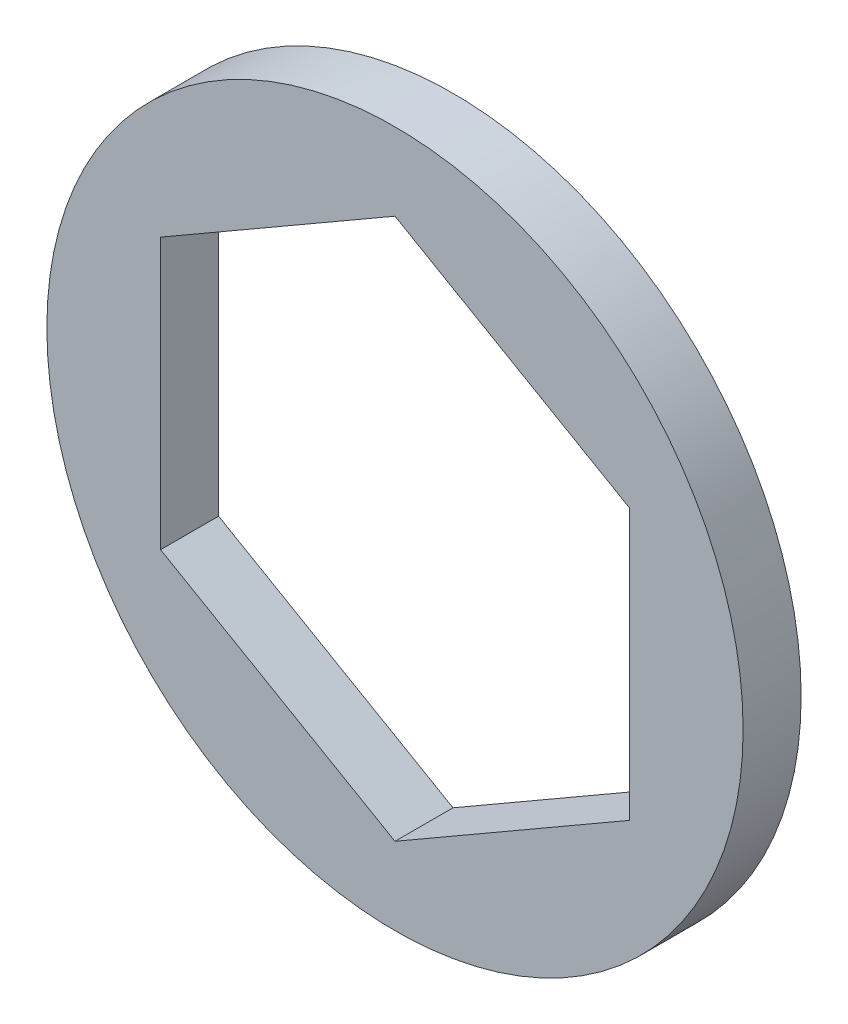
ISO-10303-21;
HEADER;
FILE_DESCRIPTION(('STEP AP214'),'2;1');
FILE_NAME('part.step','',(''),(''),'','','');
FILE_SCHEMA(('AUTOMOTIVE_DESIGN { 1 0 10303 214 1 1 1 1 }'));
ENDSEC;
DATA;
#1=APPLICATION_CONTEXT('core data for automotive mechanical design processes');
#2=APPLICATION_PROTOCOL_DEFINITION('international standard','automotive_design',2000,#1);
#3=PRODUCT_CONTEXT('',#1,'mechanical');
#4=PRODUCT('Part','Part','',(#3));
#5=PRODUCT_RELATED_PRODUCT_CATEGORY('part','',(#4));
#6=PRODUCT_DEFINITION_FORMATION('','',#4);
#7=PRODUCT_DEFINITION_CONTEXT('part definition',#1,'design');
#8=PRODUCT_DEFINITION('design','',#6,#7);
#9=PRODUCT_DEFINITION_SHAPE('','',#8);
#10=(LENGTH_UNIT() NAMED_UNIT(*) SI_UNIT(.MILLI.,.METRE.));
#11=(NAMED_UNIT(*) PLANE_ANGLE_UNIT() SI_UNIT($,.RADIAN.));
#12=(NAMED_UNIT(*) SI_UNIT($,.STERADIAN.) SOLID_ANGLE_UNIT());
#13=UNCERTAINTY_MEASURE_WITH_UNIT(LENGTH_MEASURE(1.E-05),#10,'distance_accuracy_value','');
#14=(GEOMETRIC_REPRESENTATION_CONTEXT(3) GLOBAL_UNCERTAINTY_ASSIGNED_CONTEXT((#13)) GLOBAL_UNIT_ASSIGNED_CONTEXT((#10,
#11,#12)) REPRESENTATION_CONTEXT('',''));
#15=CARTESIAN_POINT('',(0.,0.,0.));
#16=DIRECTION('',(0.,0.,1.));
#17=DIRECTION('',(1.,0.,0.));
#18=AXIS2_PLACEMENT_3D('',#15,#16,#17);
#19=CARTESIAN_POINT('',(0.,0.,1.5875));
#20=DIRECTION('',(0.,0.,1.));
#21=DIRECTION('',(1.,0.,0.));
#22=AXIS2_PLACEMENT_3D('',#19,#20,#21);
#23=PLANE('',#22);
#24=CARTESIAN_POINT('',(0.,0.,1.5875));
#25=DIRECTION('',(0.,0.,1.));
#26=DIRECTION('',(1.,0.,0.));
#27=AXIS2_PLACEMENT_3D('',#24,#25,#26);
#28=CIRCLE('',#27,9.525);
#29=CARTESIAN_POINT('',(9.525,0.,1.5875));
#30=VERTEX_POINT('',#29);
#31=EDGE_CURVE('E11',#30,#30,#28,.T.);
#32=ORIENTED_EDGE('',*,*,#31,.T.);
#33=EDGE_LOOP('',(#32));
#34=FACE_BOUND('',#33,.T.);
#35=DIRECTION('',(-0.866025403784439,0.5,0.));
#36=VECTOR('',#35,1.);
#37=CARTESIAN_POINT('',(6.4135,3.70283595144767,1.5875));
#38=LINE('',#37,#36);
#39=CARTESIAN_POINT('',(6.4135,3.70283595144767,1.5875));
#40=VERTEX_POINT('',#39);
#41=CARTESIAN_POINT('',(0.,7.40567190289533,1.5875));
#42=VERTEX_POINT('',#41);
#43=EDGE_CURVE('E112',#40,#42,#38,.T.);
#44=ORIENTED_EDGE('',*,*,#43,.F.);
#45=DIRECTION('',(0.,1.,0.));
#46=VECTOR('',#45,1.);
#47=CARTESIAN_POINT('',(6.4135,-3.70283595144767,1.5875));
#48=LINE('',#47,#46);
#49=CARTESIAN_POINT('',(6.4135,-3.70283595144767,1.5875));
#50=VERTEX_POINT('',#49);
#51=EDGE_CURVE('E103',#50,#40,#48,.T.);
#52=ORIENTED_EDGE('',*,*,#51,.F.);
#53=DIRECTION('',(0.866025403784439,0.5,0.));
#54=VECTOR('',#53,1.);
#55=CARTESIAN_POINT('',(0.,-7.40567190289533,1.5875));
#56=LINE('',#55,#54);
#57=CARTESIAN_POINT('',(0.,-7.40567190289533,1.5875));
#58=VERTEX_POINT('',#57);
#59=EDGE_CURVE('E137',#58,#50,#56,.T.);
#60=ORIENTED_EDGE('',*,*,#59,.F.);
#61=DIRECTION('',(0.866025403784439,-0.5,0.));
#62=VECTOR('',#61,1.);
#63=CARTESIAN_POINT('',(-6.4135,-3.70283595144767,1.5875));
#64=LINE('',#63,#62);
#65=CARTESIAN_POINT('',(-6.4135,-3.70283595144767,1.5875));
#66=VERTEX_POINT('',#65);
#67=EDGE_CURVE('E134',#66,#58,#64,.T.);
#68=ORIENTED_EDGE('',*,*,#67,.F.);
#69=DIRECTION('',(0.,-1.,0.));
#70=VECTOR('',#69,1.);
#71=CARTESIAN_POINT('',(-6.4135,3.70283595144767,1.5875));
#72=LINE('',#71,#70);
#73=CARTESIAN_POINT('',(-6.4135,3.70283595144767,1.5875));
#74=VERTEX_POINT('',#73);
#75=EDGE_CURVE('E129',#74,#66,#72,.T.);
#76=ORIENTED_EDGE('',*,*,#75,.F.);
#77=DIRECTION('',(-0.866025403784439,-0.5,0.));
#78=VECTOR('',#77,1.);
#79=CARTESIAN_POINT('',(0.,7.40567190289533,1.5875));
#80=LINE('',#79,#78);
#81=EDGE_CURVE('E125',#42,#74,#80,.T.);
#82=ORIENTED_EDGE('',*,*,#81,.F.);
#83=EDGE_LOOP('',(#44,#52,#60,#68,#76,#82));
#84=FACE_BOUND('',#83,.T.);
#85=ADVANCED_FACE('F49',(#34,#84),#23,.T.);
#86=CARTESIAN_POINT('',(0.,0.,0.));
#87=DIRECTION('',(0.,0.,1.));
#88=DIRECTION('',(1.,0.,0.));
#89=AXIS2_PLACEMENT_3D('',#86,#87,#88);
#90=PLANE('',#89);
#91=CARTESIAN_POINT('',(0.,0.,0.));
#92=DIRECTION('',(0.,0.,1.));
#93=DIRECTION('',(1.,0.,0.));
#94=AXIS2_PLACEMENT_3D('',#91,#92,#93);
#95=CIRCLE('',#94,9.525);
#96=CARTESIAN_POINT('',(9.525,0.,0.));
#97=VERTEX_POINT('',#96);
#98=EDGE_CURVE('E53',#97,#97,#95,.T.);
#99=ORIENTED_EDGE('',*,*,#98,.F.);
#100=EDGE_LOOP('',(#99));
#101=FACE_BOUND('',#100,.T.);
#102=DIRECTION('',(0.,1.,0.));
#103=VECTOR('',#102,1.);
#104=CARTESIAN_POINT('',(6.4135,-3.70283595144767,0.));
#105=LINE('',#104,#103);
#106=CARTESIAN_POINT('',(6.4135,-3.70283595144767,0.));
#107=VERTEX_POINT('',#106);
#108=CARTESIAN_POINT('',(6.4135,3.70283595144767,0.));
#109=VERTEX_POINT('',#108);
#110=EDGE_CURVE('E73',#107,#109,#105,.T.);
#111=ORIENTED_EDGE('',*,*,#110,.T.);
#112=DIRECTION('',(-0.866025403784439,0.5,0.));
#113=VECTOR('',#112,1.);
#114=CARTESIAN_POINT('',(6.4135,3.70283595144767,0.));
#115=LINE('',#114,#113);
#116=CARTESIAN_POINT('',(0.,7.40567190289533,0.));
#117=VERTEX_POINT('',#116);
#118=EDGE_CURVE('E119',#109,#117,#115,.T.);
#119=ORIENTED_EDGE('',*,*,#118,.T.);
#120=DIRECTION('',(-0.866025403784439,-0.5,0.));
#121=VECTOR('',#120,1.);
#122=CARTESIAN_POINT('',(0.,7.40567190289533,0.));
#123=LINE('',#122,#121);
#124=CARTESIAN_POINT('',(-6.4135,3.70283595144767,0.));
#125=VERTEX_POINT('',#124);
#126=EDGE_CURVE('E144',#117,#125,#123,.T.);
#127=ORIENTED_EDGE('',*,*,#126,.T.);
#128=DIRECTION('',(0.,-1.,0.));
#129=VECTOR('',#128,1.);
#130=CARTESIAN_POINT('',(-6.4135,3.70283595144767,0.));
#131=LINE('',#130,#129);
#132=CARTESIAN_POINT('',(-6.4135,-3.70283595144767,0.));
#133=VERTEX_POINT('',#132);
#134=EDGE_CURVE('E148',#125,#133,#131,.T.);
#135=ORIENTED_EDGE('',*,*,#134,.T.);
#136=DIRECTION('',(0.866025403784439,-0.5,0.));
#137=VECTOR('',#136,1.);
#138=CARTESIAN_POINT('',(-6.4135,-3.70283595144767,0.));
#139=LINE('',#138,#137);
#140=CARTESIAN_POINT('',(0.,-7.40567190289533,0.));
#141=VERTEX_POINT('',#140);
#142=EDGE_CURVE('E152',#133,#141,#139,.T.);
#143=ORIENTED_EDGE('',*,*,#142,.T.);
#144=DIRECTION('',(0.866025403784439,0.5,0.));
#145=VECTOR('',#144,1.);
#146=CARTESIAN_POINT('',(0.,-7.40567190289533,0.));
#147=LINE('',#146,#145);
#148=EDGE_CURVE('E113',#141,#107,#147,.T.);
#149=ORIENTED_EDGE('',*,*,#148,.T.);
#150=EDGE_LOOP('',(#111,#119,#127,#135,#143,#149));
#151=FACE_BOUND('',#150,.T.);
#152=ADVANCED_FACE('F176',(#101,#151),#90,.F.);
#153=CARTESIAN_POINT('',(0.,0.,1.5875));
#154=DIRECTION('',(0.,0.,-1.));
#155=DIRECTION('',(-1.,0.,0.));
#156=AXIS2_PLACEMENT_3D('',#153,#154,#155);
#157=CYLINDRICAL_SURFACE('',#156,9.525);
#158=ORIENTED_EDGE('',*,*,#31,.F.);
#159=EDGE_LOOP('',(#158));
#160=FACE_BOUND('',#159,.T.);
#161=ORIENTED_EDGE('',*,*,#98,.T.);
#162=EDGE_LOOP('',(#161));
#163=FACE_BOUND('',#162,.T.);
#164=ADVANCED_FACE('F51',(#160,#163),#157,.T.);
#165=CARTESIAN_POINT('',(6.4135,-3.70283595144767,1.5875));
#166=DIRECTION('',(-1.,0.,0.));
#167=DIRECTION('',(0.,-1.,0.));
#168=AXIS2_PLACEMENT_3D('',#165,#166,#167);
#169=PLANE('',#168);
#170=ORIENTED_EDGE('',*,*,#110,.F.);
#171=DIRECTION('',(0.,0.,-1.));
#172=VECTOR('',#171,1.);
#173=CARTESIAN_POINT('',(6.4135,-3.70283595144767,1.5875));
#174=LINE('',#173,#172);
#175=EDGE_CURVE('E107',#50,#107,#174,.T.);
#176=ORIENTED_EDGE('',*,*,#175,.F.);
#177=ORIENTED_EDGE('',*,*,#51,.T.);
#178=DIRECTION('',(0.,0.,-1.));
#179=VECTOR('',#178,1.);
#180=CARTESIAN_POINT('',(6.4135,3.70283595144767,1.5875));
#181=LINE('',#180,#179);
#182=EDGE_CURVE('E106',#40,#109,#181,.T.);
#183=ORIENTED_EDGE('',*,*,#182,.T.);
#184=EDGE_LOOP('',(#170,#176,#177,#183));
#185=FACE_BOUND('',#184,.T.);
#186=ADVANCED_FACE('F105',(#185),#169,.T.);
#187=CARTESIAN_POINT('',(6.4135,3.70283595144767,1.5875));
#188=DIRECTION('',(-0.5,-0.866025403784439,0.));
#189=DIRECTION('',(0.866025403784439,-0.5,0.));
#190=AXIS2_PLACEMENT_3D('',#187,#188,#189);
#191=PLANE('',#190);
#192=ORIENTED_EDGE('',*,*,#118,.F.);
#193=ORIENTED_EDGE('',*,*,#182,.F.);
#194=ORIENTED_EDGE('',*,*,#43,.T.);
#195=DIRECTION('',(0.,0.,-1.));
#196=VECTOR('',#195,1.);
#197=CARTESIAN_POINT('',(0.,7.40567190289533,1.5875));
#198=LINE('',#197,#196);
#199=EDGE_CURVE('E121',#42,#117,#198,.T.);
#200=ORIENTED_EDGE('',*,*,#199,.T.);
#201=EDGE_LOOP('',(#192,#193,#194,#200));
#202=FACE_BOUND('',#201,.T.);
#203=ADVANCED_FACE('F116',(#202),#191,.T.);
#204=CARTESIAN_POINT('',(0.,7.40567190289533,1.5875));
#205=DIRECTION('',(0.5,-0.866025403784439,0.));
#206=DIRECTION('',(0.866025403784439,0.5,0.));
#207=AXIS2_PLACEMENT_3D('',#204,#205,#206);
#208=PLANE('',#207);
#209=ORIENTED_EDGE('',*,*,#126,.F.);
#210=ORIENTED_EDGE('',*,*,#199,.F.);
#211=ORIENTED_EDGE('',*,*,#81,.T.);
#212=DIRECTION('',(0.,0.,-1.));
#213=VECTOR('',#212,1.);
#214=CARTESIAN_POINT('',(-6.4135,3.70283595144767,1.5875));
#215=LINE('',#214,#213);
#216=EDGE_CURVE('E166',#74,#125,#215,.T.);
#217=ORIENTED_EDGE('',*,*,#216,.T.);
#218=EDGE_LOOP('',(#209,#210,#211,#217));
#219=FACE_BOUND('',#218,.T.);
#220=ADVANCED_FACE('F172',(#219),#208,.T.);
#221=CARTESIAN_POINT('',(-6.4135,3.70283595144767,1.5875));
#222=DIRECTION('',(1.,0.,0.));
#223=DIRECTION('',(0.,1.,0.));
#224=AXIS2_PLACEMENT_3D('',#221,#222,#223);
#225=PLANE('',#224);
#226=ORIENTED_EDGE('',*,*,#134,.F.);
#227=ORIENTED_EDGE('',*,*,#216,.F.);
#228=ORIENTED_EDGE('',*,*,#75,.T.);
#229=DIRECTION('',(0.,0.,-1.));
#230=VECTOR('',#229,1.);
#231=CARTESIAN_POINT('',(-6.4135,-3.70283595144767,1.5875));
#232=LINE('',#231,#230);
#233=EDGE_CURVE('E163',#66,#133,#232,.T.);
#234=ORIENTED_EDGE('',*,*,#233,.T.);
#235=EDGE_LOOP('',(#226,#227,#228,#234));
#236=FACE_BOUND('',#235,.T.);
#237=ADVANCED_FACE('F184',(#236),#225,.T.);
#238=CARTESIAN_POINT('',(-6.4135,-3.70283595144767,1.5875));
#239=DIRECTION('',(0.5,0.866025403784439,0.));
#240=DIRECTION('',(-0.866025403784439,0.5,0.));
#241=AXIS2_PLACEMENT_3D('',#238,#239,#240);
#242=PLANE('',#241);
#243=ORIENTED_EDGE('',*,*,#142,.F.);
#244=ORIENTED_EDGE('',*,*,#233,.F.);
#245=ORIENTED_EDGE('',*,*,#67,.T.);
#246=DIRECTION('',(0.,0.,-1.));
#247=VECTOR('',#246,1.);
#248=CARTESIAN_POINT('',(0.,-7.40567190289533,1.5875));
#249=LINE('',#248,#247);
#250=EDGE_CURVE('E65',#58,#141,#249,.T.);
#251=ORIENTED_EDGE('',*,*,#250,.T.);
#252=EDGE_LOOP('',(#243,#244,#245,#251));
#253=FACE_BOUND('',#252,.T.);
#254=ADVANCED_FACE('F182',(#253),#242,.T.);
#255=CARTESIAN_POINT('',(0.,-7.40567190289533,1.5875));
#256=DIRECTION('',(-0.5,0.866025403784439,0.));
#257=DIRECTION('',(-0.866025403784439,-0.5,0.));
#258=AXIS2_PLACEMENT_3D('',#255,#256,#257);
#259=PLANE('',#258);
#260=ORIENTED_EDGE('',*,*,#148,.F.);
#261=ORIENTED_EDGE('',*,*,#250,.F.);
#262=ORIENTED_EDGE('',*,*,#59,.T.);
#263=ORIENTED_EDGE('',*,*,#175,.T.);
#264=EDGE_LOOP('',(#260,#261,#262,#263));
#265=FACE_BOUND('',#264,.T.);
#266=ADVANCED_FACE('F178',(#265),#259,.T.);
#267=CLOSED_SHELL('',(#85,#152,#164,#186,#203,#220,#237,#254,#266));
#268=MANIFOLD_SOLID_BREP('B2',#267);
#269=ADVANCED_BREP_SHAPE_REPRESENTATION('',(#18,#268),#14);
#270=SHAPE_DEFINITION_REPRESENTATION(#9,#269);
ENDSEC;
END-ISO-10303-21;
